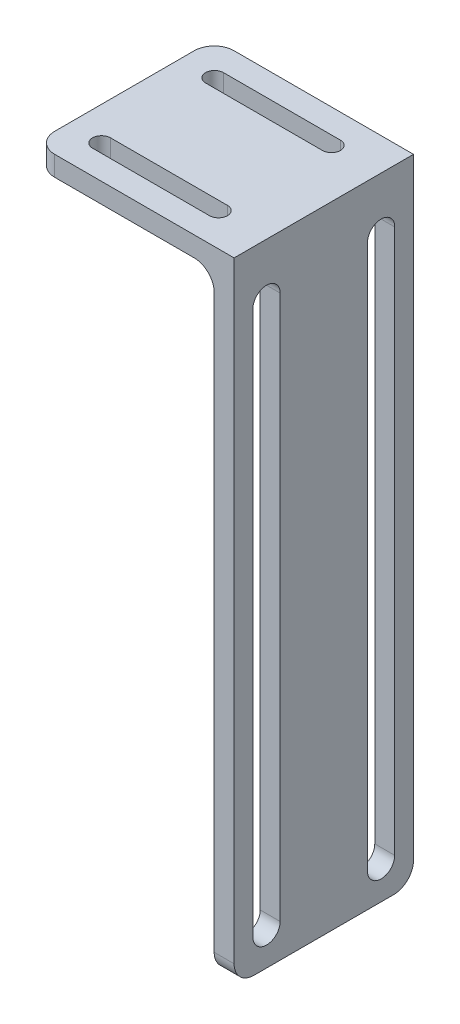
ISO-10303-21;
HEADER;
FILE_DESCRIPTION(('STEP AP214'),'2;1');
FILE_NAME('part.step','',(''),(''),'','','');
FILE_SCHEMA(('AUTOMOTIVE_DESIGN { 1 0 10303 214 1 1 1 1 }'));
ENDSEC;
DATA;
#1=APPLICATION_CONTEXT('core data for automotive mechanical design processes');
#2=APPLICATION_PROTOCOL_DEFINITION('international standard','automotive_design',2000,#1);
#3=PRODUCT_CONTEXT('',#1,'mechanical');
#4=PRODUCT('Part','Part','',(#3));
#5=PRODUCT_RELATED_PRODUCT_CATEGORY('part','',(#4));
#6=PRODUCT_DEFINITION_FORMATION('','',#4);
#7=PRODUCT_DEFINITION_CONTEXT('part definition',#1,'design');
#8=PRODUCT_DEFINITION('design','',#6,#7);
#9=PRODUCT_DEFINITION_SHAPE('','',#8);
#10=(LENGTH_UNIT() NAMED_UNIT(*) SI_UNIT(.MILLI.,.METRE.));
#11=(NAMED_UNIT(*) PLANE_ANGLE_UNIT() SI_UNIT($,.RADIAN.));
#12=(NAMED_UNIT(*) SI_UNIT($,.STERADIAN.) SOLID_ANGLE_UNIT());
#13=UNCERTAINTY_MEASURE_WITH_UNIT(LENGTH_MEASURE(1.E-05),#10,'distance_accuracy_value','');
#14=(GEOMETRIC_REPRESENTATION_CONTEXT(3) GLOBAL_UNCERTAINTY_ASSIGNED_CONTEXT((#13)) GLOBAL_UNIT_ASSIGNED_CONTEXT((#10,
#11,#12)) REPRESENTATION_CONTEXT('',''));
#15=CARTESIAN_POINT('',(0.,0.,0.));
#16=DIRECTION('',(0.,0.,1.));
#17=DIRECTION('',(1.,0.,0.));
#18=AXIS2_PLACEMENT_3D('',#15,#16,#17);
#19=CARTESIAN_POINT('',(0.,92.0000000000005,27.));
#20=DIRECTION('',(1.,0.,0.));
#21=DIRECTION('',(0.,0.,-1.));
#22=AXIS2_PLACEMENT_3D('',#19,#20,#21);
#23=PLANE('',#22);
#24=DIRECTION('',(0.,-1.,0.));
#25=VECTOR('',#24,1.);
#26=CARTESIAN_POINT('',(0.,92.0000000000005,0.));
#27=LINE('',#26,#25);
#28=CARTESIAN_POINT('',(0.,89.0000000000005,0.));
#29=VERTEX_POINT('',#28);
#30=CARTESIAN_POINT('',(0.,3.,0.));
#31=VERTEX_POINT('',#30);
#32=EDGE_CURVE('E394',#29,#31,#27,.T.);
#33=ORIENTED_EDGE('',*,*,#32,.T.);
#34=CARTESIAN_POINT('',(0.,3.,3.));
#35=DIRECTION('',(1.,0.,0.));
#36=DIRECTION('',(0.,0.,-1.));
#37=AXIS2_PLACEMENT_3D('',#34,#35,#36);
#38=CIRCLE('',#37,3.);
#39=CARTESIAN_POINT('',(0.,0.,3.));
#40=VERTEX_POINT('',#39);
#41=EDGE_CURVE('E520',#31,#40,#38,.F.);
#42=ORIENTED_EDGE('',*,*,#41,.T.);
#43=DIRECTION('',(0.,0.,-1.));
#44=VECTOR('',#43,1.);
#45=CARTESIAN_POINT('',(0.,0.,27.));
#46=LINE('',#45,#44);
#47=CARTESIAN_POINT('',(0.,0.,24.));
#48=VERTEX_POINT('',#47);
#49=EDGE_CURVE('E436',#48,#40,#46,.T.);
#50=ORIENTED_EDGE('',*,*,#49,.F.);
#51=CARTESIAN_POINT('',(0.,3.,24.));
#52=DIRECTION('',(1.,0.,0.));
#53=DIRECTION('',(0.,0.,-1.));
#54=AXIS2_PLACEMENT_3D('',#51,#52,#53);
#55=CIRCLE('',#54,3.);
#56=CARTESIAN_POINT('',(0.,3.,27.));
#57=VERTEX_POINT('',#56);
#58=EDGE_CURVE('E517',#48,#57,#55,.F.);
#59=ORIENTED_EDGE('',*,*,#58,.T.);
#60=DIRECTION('',(0.,-1.,0.));
#61=VECTOR('',#60,1.);
#62=CARTESIAN_POINT('',(0.,92.0000000000005,27.));
#63=LINE('',#62,#61);
#64=CARTESIAN_POINT('',(0.,89.0000000000005,27.));
#65=VERTEX_POINT('',#64);
#66=EDGE_CURVE('E395',#65,#57,#63,.T.);
#67=ORIENTED_EDGE('',*,*,#66,.F.);
#68=DIRECTION('',(0.,0.,-1.));
#69=VECTOR('',#68,1.);
#70=CARTESIAN_POINT('',(0.,89.0000000000005,0.));
#71=LINE('',#70,#69);
#72=CARTESIAN_POINT('',(0.,89.0000000000005,22.12));
#73=VERTEX_POINT('',#72);
#74=EDGE_CURVE('E477',#65,#73,#71,.T.);
#75=ORIENTED_EDGE('',*,*,#74,.T.);
#76=CARTESIAN_POINT('',(0.,86.9500000000007,22.12));
#77=DIRECTION('',(1.,0.,0.));
#78=DIRECTION('',(0.,0.,-1.));
#79=AXIS2_PLACEMENT_3D('',#76,#77,#78);
#80=CIRCLE('',#79,2.05);
#81=CARTESIAN_POINT('',(0.,86.9500000000007,24.17));
#82=VERTEX_POINT('',#81);
#83=EDGE_CURVE('E389',#73,#82,#80,.T.);
#84=ORIENTED_EDGE('',*,*,#83,.T.);
#85=DIRECTION('',(0.,-1.,0.));
#86=VECTOR('',#85,1.);
#87=CARTESIAN_POINT('',(0.,92.0000000000005,24.17));
#88=LINE('',#87,#86);
#89=CARTESIAN_POINT('',(0.,5.05,24.17));
#90=VERTEX_POINT('',#89);
#91=EDGE_CURVE('E377',#82,#90,#88,.T.);
#92=ORIENTED_EDGE('',*,*,#91,.T.);
#93=CARTESIAN_POINT('',(0.,5.05,22.12));
#94=DIRECTION('',(1.,0.,0.));
#95=DIRECTION('',(0.,0.,-1.));
#96=AXIS2_PLACEMENT_3D('',#93,#94,#95);
#97=CIRCLE('',#96,2.05);
#98=CARTESIAN_POINT('',(0.,5.05,20.07));
#99=VERTEX_POINT('',#98);
#100=EDGE_CURVE('E381',#90,#99,#97,.T.);
#101=ORIENTED_EDGE('',*,*,#100,.T.);
#102=DIRECTION('',(0.,1.,0.));
#103=VECTOR('',#102,1.);
#104=CARTESIAN_POINT('',(0.,92.0000000000005,20.07));
#105=LINE('',#104,#103);
#106=CARTESIAN_POINT('',(0.,86.9500000000007,20.07));
#107=VERTEX_POINT('',#106);
#108=EDGE_CURVE('E385',#99,#107,#105,.T.);
#109=ORIENTED_EDGE('',*,*,#108,.T.);
#110=EDGE_CURVE('E390',#107,#73,#80,.T.);
#111=ORIENTED_EDGE('',*,*,#110,.T.);
#112=DIRECTION('',(0.,0.,-1.));
#113=VECTOR('',#112,1.);
#114=CARTESIAN_POINT('',(0.,89.0000000000005,0.));
#115=LINE('',#114,#113);
#116=CARTESIAN_POINT('',(0.,89.0000000000005,4.88));
#117=VERTEX_POINT('',#116);
#118=EDGE_CURVE('E474',#73,#117,#115,.T.);
#119=ORIENTED_EDGE('',*,*,#118,.T.);
#120=CARTESIAN_POINT('',(0.,86.9500000000007,4.88));
#121=DIRECTION('',(1.,0.,0.));
#122=DIRECTION('',(0.,0.,-1.));
#123=AXIS2_PLACEMENT_3D('',#120,#121,#122);
#124=CIRCLE('',#123,2.05);
#125=CARTESIAN_POINT('',(0.,86.9500000000007,6.93));
#126=VERTEX_POINT('',#125);
#127=EDGE_CURVE('E372',#117,#126,#124,.T.);
#128=ORIENTED_EDGE('',*,*,#127,.T.);
#129=DIRECTION('',(0.,-1.,0.));
#130=VECTOR('',#129,1.);
#131=CARTESIAN_POINT('',(0.,92.0000000000005,6.93));
#132=LINE('',#131,#130);
#133=CARTESIAN_POINT('',(0.,5.05,6.92999999999999));
#134=VERTEX_POINT('',#133);
#135=EDGE_CURVE('E325',#126,#134,#132,.T.);
#136=ORIENTED_EDGE('',*,*,#135,.T.);
#137=CARTESIAN_POINT('',(0.,5.05,4.87999999999999));
#138=DIRECTION('',(1.,0.,0.));
#139=DIRECTION('',(0.,0.,-1.));
#140=AXIS2_PLACEMENT_3D('',#137,#138,#139);
#141=CIRCLE('',#140,2.05);
#142=CARTESIAN_POINT('',(0.,5.05,2.82999999999999));
#143=VERTEX_POINT('',#142);
#144=EDGE_CURVE('E364',#134,#143,#141,.T.);
#145=ORIENTED_EDGE('',*,*,#144,.T.);
#146=DIRECTION('',(0.,1.,0.));
#147=VECTOR('',#146,1.);
#148=CARTESIAN_POINT('',(0.,92.0000000000005,2.83));
#149=LINE('',#148,#147);
#150=CARTESIAN_POINT('',(0.,86.9500000000007,2.83));
#151=VERTEX_POINT('',#150);
#152=EDGE_CURVE('E368',#143,#151,#149,.T.);
#153=ORIENTED_EDGE('',*,*,#152,.T.);
#154=EDGE_CURVE('E373',#151,#117,#124,.T.);
#155=ORIENTED_EDGE('',*,*,#154,.T.);
#156=DIRECTION('',(0.,0.,-1.));
#157=VECTOR('',#156,1.);
#158=CARTESIAN_POINT('',(0.,89.0000000000005,0.));
#159=LINE('',#158,#157);
#160=EDGE_CURVE('E471',#117,#29,#159,.T.);
#161=ORIENTED_EDGE('',*,*,#160,.T.);
#162=EDGE_LOOP('',(#33,#42,#50,#59,#67,#75,#84,#92,#101,#109,#111,#119,#128,#136,#145,#153,#155,#161));
#163=FACE_BOUND('',#162,.T.);
#164=ADVANCED_FACE('F41',(#163),#23,.F.);
#165=CARTESIAN_POINT('',(0.,0.,27.));
#166=DIRECTION('',(0.,1.,0.));
#167=DIRECTION('',(0.,0.,1.));
#168=AXIS2_PLACEMENT_3D('',#165,#166,#167);
#169=PLANE('',#168);
#170=ORIENTED_EDGE('',*,*,#49,.T.);
#171=DIRECTION('',(1.,0.,0.));
#172=VECTOR('',#171,1.);
#173=CARTESIAN_POINT('',(0.,0.,3.));
#174=LINE('',#173,#172);
#175=CARTESIAN_POINT('',(3.,0.,3.));
#176=VERTEX_POINT('',#175);
#177=EDGE_CURVE('E501',#40,#176,#174,.T.);
#178=ORIENTED_EDGE('',*,*,#177,.T.);
#179=DIRECTION('',(0.,0.,-1.));
#180=VECTOR('',#179,1.);
#181=CARTESIAN_POINT('',(3.,0.,27.));
#182=LINE('',#181,#180);
#183=CARTESIAN_POINT('',(3.,0.,24.));
#184=VERTEX_POINT('',#183);
#185=EDGE_CURVE('E432',#184,#176,#182,.T.);
#186=ORIENTED_EDGE('',*,*,#185,.F.);
#187=DIRECTION('',(1.,0.,0.));
#188=VECTOR('',#187,1.);
#189=CARTESIAN_POINT('',(0.,0.,24.));
#190=LINE('',#189,#188);
#191=EDGE_CURVE('E498',#184,#48,#190,.F.);
#192=ORIENTED_EDGE('',*,*,#191,.T.);
#193=EDGE_LOOP('',(#170,#178,#186,#192));
#194=FACE_BOUND('',#193,.T.);
#195=ADVANCED_FACE('F581',(#194),#169,.F.);
#196=CARTESIAN_POINT('',(3.,0.,27.));
#197=DIRECTION('',(-1.,0.,0.));
#198=DIRECTION('',(0.,0.,1.));
#199=AXIS2_PLACEMENT_3D('',#196,#197,#198);
#200=PLANE('',#199);
#201=DIRECTION('',(0.,-1.,0.));
#202=VECTOR('',#201,1.);
#203=CARTESIAN_POINT('',(3.,86.9500000000007,24.17));
#204=LINE('',#203,#202);
#205=CARTESIAN_POINT('',(3.,86.9500000000007,24.17));
#206=VERTEX_POINT('',#205);
#207=CARTESIAN_POINT('',(3.,5.05,24.17));
#208=VERTEX_POINT('',#207);
#209=EDGE_CURVE('E308',#206,#208,#204,.T.);
#210=ORIENTED_EDGE('',*,*,#209,.F.);
#211=CARTESIAN_POINT('',(3.,86.9500000000007,22.12));
#212=DIRECTION('',(1.,0.,0.));
#213=DIRECTION('',(0.,0.,-1.));
#214=AXIS2_PLACEMENT_3D('',#211,#212,#213);
#215=CIRCLE('',#214,2.05);
#216=CARTESIAN_POINT('',(3.,86.9500000000007,20.07));
#217=VERTEX_POINT('',#216);
#218=EDGE_CURVE('E305',#217,#206,#215,.T.);
#219=ORIENTED_EDGE('',*,*,#218,.F.);
#220=DIRECTION('',(0.,1.,0.));
#221=VECTOR('',#220,1.);
#222=CARTESIAN_POINT('',(3.,86.9500000000007,20.07));
#223=LINE('',#222,#221);
#224=CARTESIAN_POINT('',(3.,5.05,20.07));
#225=VERTEX_POINT('',#224);
#226=EDGE_CURVE('E317',#225,#217,#223,.T.);
#227=ORIENTED_EDGE('',*,*,#226,.F.);
#228=CARTESIAN_POINT('',(3.,5.05,22.12));
#229=DIRECTION('',(1.,0.,0.));
#230=DIRECTION('',(0.,0.,-1.));
#231=AXIS2_PLACEMENT_3D('',#228,#229,#230);
#232=CIRCLE('',#231,2.05);
#233=EDGE_CURVE('E313',#208,#225,#232,.T.);
#234=ORIENTED_EDGE('',*,*,#233,.F.);
#235=EDGE_LOOP('',(#210,#219,#227,#234));
#236=FACE_BOUND('',#235,.T.);
#237=DIRECTION('',(0.,-1.,0.));
#238=VECTOR('',#237,1.);
#239=CARTESIAN_POINT('',(3.,86.9500000000007,6.93));
#240=LINE('',#239,#238);
#241=CARTESIAN_POINT('',(3.,86.9500000000007,6.93));
#242=VERTEX_POINT('',#241);
#243=CARTESIAN_POINT('',(3.,5.05,6.92999999999999));
#244=VERTEX_POINT('',#243);
#245=EDGE_CURVE('E337',#242,#244,#240,.T.);
#246=ORIENTED_EDGE('',*,*,#245,.F.);
#247=CARTESIAN_POINT('',(3.,86.9500000000007,4.88));
#248=DIRECTION('',(1.,0.,0.));
#249=DIRECTION('',(0.,0.,-1.));
#250=AXIS2_PLACEMENT_3D('',#247,#248,#249);
#251=CIRCLE('',#250,2.05);
#252=CARTESIAN_POINT('',(3.,86.9500000000007,2.83));
#253=VERTEX_POINT('',#252);
#254=EDGE_CURVE('E272',#253,#242,#251,.T.);
#255=ORIENTED_EDGE('',*,*,#254,.F.);
#256=DIRECTION('',(0.,1.,0.));
#257=VECTOR('',#256,1.);
#258=CARTESIAN_POINT('',(3.,86.9500000000007,2.83));
#259=LINE('',#258,#257);
#260=CARTESIAN_POINT('',(3.,5.05,2.82999999999999));
#261=VERTEX_POINT('',#260);
#262=EDGE_CURVE('E345',#261,#253,#259,.T.);
#263=ORIENTED_EDGE('',*,*,#262,.F.);
#264=CARTESIAN_POINT('',(3.,5.05,4.87999999999999));
#265=DIRECTION('',(1.,0.,0.));
#266=DIRECTION('',(0.,0.,-1.));
#267=AXIS2_PLACEMENT_3D('',#264,#265,#266);
#268=CIRCLE('',#267,2.05);
#269=EDGE_CURVE('E341',#244,#261,#268,.T.);
#270=ORIENTED_EDGE('',*,*,#269,.F.);
#271=EDGE_LOOP('',(#246,#255,#263,#270));
#272=FACE_BOUND('',#271,.T.);
#273=ORIENTED_EDGE('',*,*,#185,.T.);
#274=CARTESIAN_POINT('',(3.,3.,3.));
#275=DIRECTION('',(-1.,0.,0.));
#276=DIRECTION('',(0.,0.,1.));
#277=AXIS2_PLACEMENT_3D('',#274,#275,#276);
#278=CIRCLE('',#277,3.);
#279=CARTESIAN_POINT('',(3.,3.,0.));
#280=VERTEX_POINT('',#279);
#281=EDGE_CURVE('E508',#176,#280,#278,.F.);
#282=ORIENTED_EDGE('',*,*,#281,.T.);
#283=DIRECTION('',(0.,1.,0.));
#284=VECTOR('',#283,1.);
#285=CARTESIAN_POINT('',(3.,0.,0.));
#286=LINE('',#285,#284);
#287=CARTESIAN_POINT('',(3.,95.0000000000006,0.));
#288=VERTEX_POINT('',#287);
#289=EDGE_CURVE('E414',#280,#288,#286,.T.);
#290=ORIENTED_EDGE('',*,*,#289,.T.);
#291=DIRECTION('',(0.,0.,-1.));
#292=VECTOR('',#291,1.);
#293=CARTESIAN_POINT('',(3.,95.0000000000006,27.));
#294=LINE('',#293,#292);
#295=CARTESIAN_POINT('',(3.,95.0000000000006,27.));
#296=VERTEX_POINT('',#295);
#297=EDGE_CURVE('E428',#296,#288,#294,.T.);
#298=ORIENTED_EDGE('',*,*,#297,.F.);
#299=DIRECTION('',(0.,1.,0.));
#300=VECTOR('',#299,1.);
#301=CARTESIAN_POINT('',(3.,0.,27.));
#302=LINE('',#301,#300);
#303=CARTESIAN_POINT('',(3.,3.,27.));
#304=VERTEX_POINT('',#303);
#305=EDGE_CURVE('E399',#304,#296,#302,.T.);
#306=ORIENTED_EDGE('',*,*,#305,.F.);
#307=CARTESIAN_POINT('',(3.,3.,24.));
#308=DIRECTION('',(-1.,0.,0.));
#309=DIRECTION('',(0.,0.,1.));
#310=AXIS2_PLACEMENT_3D('',#307,#308,#309);
#311=CIRCLE('',#310,3.);
#312=EDGE_CURVE('E505',#304,#184,#311,.F.);
#313=ORIENTED_EDGE('',*,*,#312,.T.);
#314=EDGE_LOOP('',(#273,#282,#290,#298,#306,#313));
#315=FACE_BOUND('',#314,.T.);
#316=ADVANCED_FACE('F561',(#236,#272,#315),#200,.F.);
#317=CARTESIAN_POINT('',(3.,95.0000000000006,27.));
#318=DIRECTION('',(0.,-1.,0.));
#319=DIRECTION('',(0.,0.,-1.));
#320=AXIS2_PLACEMENT_3D('',#317,#318,#319);
#321=PLANE('',#320);
#322=DIRECTION('',(1.,0.,0.));
#323=VECTOR('',#322,1.);
#324=CARTESIAN_POINT('',(-21.95,95.0000000000006,6.35));
#325=LINE('',#324,#323);
#326=CARTESIAN_POINT('',(-21.95,95.0000000000006,6.35));
#327=VERTEX_POINT('',#326);
#328=CARTESIAN_POINT('',(-4.35,95.0000000000006,6.35));
#329=VERTEX_POINT('',#328);
#330=EDGE_CURVE('E251',#327,#329,#325,.T.);
#331=ORIENTED_EDGE('',*,*,#330,.F.);
#332=CARTESIAN_POINT('',(-21.95,95.0000000000006,5.));
#333=DIRECTION('',(0.,1.,0.));
#334=DIRECTION('',(0.,0.,1.));
#335=AXIS2_PLACEMENT_3D('',#332,#333,#334);
#336=CIRCLE('',#335,1.35);
#337=CARTESIAN_POINT('',(-21.95,95.0000000000006,3.65));
#338=VERTEX_POINT('',#337);
#339=EDGE_CURVE('E257',#338,#327,#336,.T.);
#340=ORIENTED_EDGE('',*,*,#339,.F.);
#341=DIRECTION('',(1.,0.,0.));
#342=VECTOR('',#341,1.);
#343=CARTESIAN_POINT('',(-21.95,95.0000000000006,3.65));
#344=LINE('',#343,#342);
#345=CARTESIAN_POINT('',(-4.35,95.0000000000006,3.65));
#346=VERTEX_POINT('',#345);
#347=EDGE_CURVE('E262',#338,#346,#344,.T.);
#348=ORIENTED_EDGE('',*,*,#347,.T.);
#349=CARTESIAN_POINT('',(-4.35,95.0000000000006,5.));
#350=DIRECTION('',(0.,1.,0.));
#351=DIRECTION('',(0.,0.,1.));
#352=AXIS2_PLACEMENT_3D('',#349,#350,#351);
#353=CIRCLE('',#352,1.35);
#354=EDGE_CURVE('E238',#329,#346,#353,.T.);
#355=ORIENTED_EDGE('',*,*,#354,.F.);
#356=EDGE_LOOP('',(#331,#340,#348,#355));
#357=FACE_BOUND('',#356,.T.);
#358=DIRECTION('',(1.,0.,0.));
#359=VECTOR('',#358,1.);
#360=CARTESIAN_POINT('',(-21.95,95.0000000000006,23.35));
#361=LINE('',#360,#359);
#362=CARTESIAN_POINT('',(-21.95,95.0000000000006,23.35));
#363=VERTEX_POINT('',#362);
#364=CARTESIAN_POINT('',(-4.35000000000001,95.0000000000006,23.35));
#365=VERTEX_POINT('',#364);
#366=EDGE_CURVE('E298',#363,#365,#361,.T.);
#367=ORIENTED_EDGE('',*,*,#366,.F.);
#368=CARTESIAN_POINT('',(-21.95,95.0000000000006,22.));
#369=DIRECTION('',(0.,1.,0.));
#370=DIRECTION('',(0.,0.,1.));
#371=AXIS2_PLACEMENT_3D('',#368,#369,#370);
#372=CIRCLE('',#371,1.35);
#373=CARTESIAN_POINT('',(-21.95,95.0000000000006,20.65));
#374=VERTEX_POINT('',#373);
#375=EDGE_CURVE('E302',#374,#363,#372,.T.);
#376=ORIENTED_EDGE('',*,*,#375,.F.);
#377=DIRECTION('',(1.,0.,0.));
#378=VECTOR('',#377,1.);
#379=CARTESIAN_POINT('',(-21.95,95.0000000000006,20.65));
#380=LINE('',#379,#378);
#381=CARTESIAN_POINT('',(-4.35000000000001,95.0000000000006,20.65));
#382=VERTEX_POINT('',#381);
#383=EDGE_CURVE('E281',#374,#382,#380,.T.);
#384=ORIENTED_EDGE('',*,*,#383,.T.);
#385=CARTESIAN_POINT('',(-4.35000000000001,95.0000000000006,22.));
#386=DIRECTION('',(0.,1.,0.));
#387=DIRECTION('',(0.,0.,1.));
#388=AXIS2_PLACEMENT_3D('',#385,#386,#387);
#389=CIRCLE('',#388,1.35);
#390=EDGE_CURVE('E294',#365,#382,#389,.T.);
#391=ORIENTED_EDGE('',*,*,#390,.F.);
#392=EDGE_LOOP('',(#367,#376,#384,#391));
#393=FACE_BOUND('',#392,.T.);
#394=DIRECTION('',(0.,0.,-1.));
#395=VECTOR('',#394,1.);
#396=CARTESIAN_POINT('',(-27.,95.0000000000006,27.));
#397=LINE('',#396,#395);
#398=CARTESIAN_POINT('',(-27.,95.0000000000006,24.));
#399=VERTEX_POINT('',#398);
#400=CARTESIAN_POINT('',(-27.,95.0000000000006,3.));
#401=VERTEX_POINT('',#400);
#402=EDGE_CURVE('E425',#399,#401,#397,.T.);
#403=ORIENTED_EDGE('',*,*,#402,.F.);
#404=CARTESIAN_POINT('',(-24.,95.0000000000006,24.));
#405=DIRECTION('',(0.,-1.,0.));
#406=DIRECTION('',(0.,0.,-1.));
#407=AXIS2_PLACEMENT_3D('',#404,#405,#406);
#408=CIRCLE('',#407,3.);
#409=CARTESIAN_POINT('',(-24.,95.0000000000006,27.));
#410=VERTEX_POINT('',#409);
#411=EDGE_CURVE('E11',#399,#410,#408,.F.);
#412=ORIENTED_EDGE('',*,*,#411,.T.);
#413=DIRECTION('',(-1.,0.,0.));
#414=VECTOR('',#413,1.);
#415=CARTESIAN_POINT('',(3.,95.0000000000006,27.));
#416=LINE('',#415,#414);
#417=EDGE_CURVE('E403',#296,#410,#416,.T.);
#418=ORIENTED_EDGE('',*,*,#417,.F.);
#419=ORIENTED_EDGE('',*,*,#297,.T.);
#420=DIRECTION('',(-1.,0.,0.));
#421=VECTOR('',#420,1.);
#422=CARTESIAN_POINT('',(3.,95.0000000000006,0.));
#423=LINE('',#422,#421);
#424=CARTESIAN_POINT('',(-24.,95.0000000000006,0.));
#425=VERTEX_POINT('',#424);
#426=EDGE_CURVE('E417',#288,#425,#423,.T.);
#427=ORIENTED_EDGE('',*,*,#426,.T.);
#428=CARTESIAN_POINT('',(-24.,95.0000000000006,3.));
#429=DIRECTION('',(0.,-1.,0.));
#430=DIRECTION('',(0.,0.,-1.));
#431=AXIS2_PLACEMENT_3D('',#428,#429,#430);
#432=CIRCLE('',#431,3.);
#433=EDGE_CURVE('E50',#425,#401,#432,.F.);
#434=ORIENTED_EDGE('',*,*,#433,.T.);
#435=EDGE_LOOP('',(#403,#412,#418,#419,#427,#434));
#436=FACE_BOUND('',#435,.T.);
#437=ADVANCED_FACE('F259',(#357,#393,#436),#321,.F.);
#438=CARTESIAN_POINT('',(-27.,95.0000000000006,27.));
#439=DIRECTION('',(1.,0.,0.));
#440=DIRECTION('',(0.,1.,0.));
#441=AXIS2_PLACEMENT_3D('',#438,#439,#440);
#442=PLANE('',#441);
#443=DIRECTION('',(0.,0.,-1.));
#444=VECTOR('',#443,1.);
#445=CARTESIAN_POINT('',(-27.,92.0000000000005,27.));
#446=LINE('',#445,#444);
#447=CARTESIAN_POINT('',(-27.,92.0000000000005,24.));
#448=VERTEX_POINT('',#447);
#449=CARTESIAN_POINT('',(-27.,92.0000000000005,3.));
#450=VERTEX_POINT('',#449);
#451=EDGE_CURVE('E410',#448,#450,#446,.T.);
#452=ORIENTED_EDGE('',*,*,#451,.F.);
#453=DIRECTION('',(0.,-1.,0.));
#454=VECTOR('',#453,1.);
#455=CARTESIAN_POINT('',(-27.,95.0000000000006,24.));
#456=LINE('',#455,#454);
#457=EDGE_CURVE('E63',#448,#399,#456,.F.);
#458=ORIENTED_EDGE('',*,*,#457,.T.);
#459=ORIENTED_EDGE('',*,*,#402,.T.);
#460=DIRECTION('',(0.,-1.,0.));
#461=VECTOR('',#460,1.);
#462=CARTESIAN_POINT('',(-27.,95.0000000000006,3.));
#463=LINE('',#462,#461);
#464=EDGE_CURVE('E537',#401,#450,#463,.T.);
#465=ORIENTED_EDGE('',*,*,#464,.T.);
#466=EDGE_LOOP('',(#452,#458,#459,#465));
#467=FACE_BOUND('',#466,.T.);
#468=ADVANCED_FACE('F624',(#467),#442,.F.);
#469=CARTESIAN_POINT('',(-27.,92.0000000000005,27.));
#470=DIRECTION('',(0.,1.,0.));
#471=DIRECTION('',(0.,0.,1.));
#472=AXIS2_PLACEMENT_3D('',#469,#470,#471);
#473=PLANE('',#472);
#474=DIRECTION('',(1.,0.,0.));
#475=VECTOR('',#474,1.);
#476=CARTESIAN_POINT('',(-27.,92.0000000000005,27.));
#477=LINE('',#476,#475);
#478=CARTESIAN_POINT('',(-24.,92.0000000000005,27.));
#479=VERTEX_POINT('',#478);
#480=CARTESIAN_POINT('',(-3.,92.0000000000005,27.));
#481=VERTEX_POINT('',#480);
#482=EDGE_CURVE('E407',#479,#481,#477,.T.);
#483=ORIENTED_EDGE('',*,*,#482,.F.);
#484=CARTESIAN_POINT('',(-24.,92.0000000000005,24.));
#485=DIRECTION('',(0.,1.,0.));
#486=DIRECTION('',(0.,0.,1.));
#487=AXIS2_PLACEMENT_3D('',#484,#485,#486);
#488=CIRCLE('',#487,3.);
#489=EDGE_CURVE('E534',#479,#448,#488,.F.);
#490=ORIENTED_EDGE('',*,*,#489,.T.);
#491=ORIENTED_EDGE('',*,*,#451,.T.);
#492=CARTESIAN_POINT('',(-24.,92.0000000000005,3.));
#493=DIRECTION('',(0.,1.,0.));
#494=DIRECTION('',(0.,0.,1.));
#495=AXIS2_PLACEMENT_3D('',#492,#493,#494);
#496=CIRCLE('',#495,3.);
#497=CARTESIAN_POINT('',(-24.,92.0000000000005,0.));
#498=VERTEX_POINT('',#497);
#499=EDGE_CURVE('E531',#450,#498,#496,.F.);
#500=ORIENTED_EDGE('',*,*,#499,.T.);
#501=DIRECTION('',(1.,0.,0.));
#502=VECTOR('',#501,1.);
#503=CARTESIAN_POINT('',(-27.,92.0000000000005,0.));
#504=LINE('',#503,#502);
#505=CARTESIAN_POINT('',(-3.,92.0000000000005,0.));
#506=VERTEX_POINT('',#505);
#507=EDGE_CURVE('E400',#498,#506,#504,.T.);
#508=ORIENTED_EDGE('',*,*,#507,.T.);
#509=DIRECTION('',(0.,0.,-1.));
#510=VECTOR('',#509,1.);
#511=CARTESIAN_POINT('',(-3.,92.0000000000005,27.));
#512=LINE('',#511,#510);
#513=CARTESIAN_POINT('',(-3.,92.0000000000005,5.));
#514=VERTEX_POINT('',#513);
#515=EDGE_CURVE('E488',#506,#514,#512,.F.);
#516=ORIENTED_EDGE('',*,*,#515,.T.);
#517=CARTESIAN_POINT('',(-4.35,92.0000000000005,5.));
#518=DIRECTION('',(0.,1.,0.));
#519=DIRECTION('',(0.,0.,1.));
#520=AXIS2_PLACEMENT_3D('',#517,#518,#519);
#521=CIRCLE('',#520,1.35);
#522=CARTESIAN_POINT('',(-4.35,92.0000000000005,3.65));
#523=VERTEX_POINT('',#522);
#524=EDGE_CURVE('E460',#514,#523,#521,.T.);
#525=ORIENTED_EDGE('',*,*,#524,.T.);
#526=DIRECTION('',(1.,0.,0.));
#527=VECTOR('',#526,1.);
#528=CARTESIAN_POINT('',(-27.,92.0000000000005,3.65));
#529=LINE('',#528,#527);
#530=CARTESIAN_POINT('',(-21.95,92.0000000000005,3.65));
#531=VERTEX_POINT('',#530);
#532=EDGE_CURVE('E463',#531,#523,#529,.T.);
#533=ORIENTED_EDGE('',*,*,#532,.F.);
#534=CARTESIAN_POINT('',(-21.95,92.0000000000005,5.));
#535=DIRECTION('',(0.,1.,0.));
#536=DIRECTION('',(0.,0.,1.));
#537=AXIS2_PLACEMENT_3D('',#534,#535,#536);
#538=CIRCLE('',#537,1.35);
#539=CARTESIAN_POINT('',(-21.95,92.0000000000005,6.35));
#540=VERTEX_POINT('',#539);
#541=EDGE_CURVE('E467',#531,#540,#538,.T.);
#542=ORIENTED_EDGE('',*,*,#541,.T.);
#543=DIRECTION('',(1.,0.,0.));
#544=VECTOR('',#543,1.);
#545=CARTESIAN_POINT('',(-27.,92.0000000000005,6.35));
#546=LINE('',#545,#544);
#547=CARTESIAN_POINT('',(-4.35,92.0000000000005,6.35));
#548=VERTEX_POINT('',#547);
#549=EDGE_CURVE('E457',#540,#548,#546,.T.);
#550=ORIENTED_EDGE('',*,*,#549,.T.);
#551=EDGE_CURVE('E242',#548,#514,#521,.T.);
#552=ORIENTED_EDGE('',*,*,#551,.T.);
#553=DIRECTION('',(0.,0.,-1.));
#554=VECTOR('',#553,1.);
#555=CARTESIAN_POINT('',(-3.,92.0000000000005,27.));
#556=LINE('',#555,#554);
#557=CARTESIAN_POINT('',(-3.,92.0000000000005,22.));
#558=VERTEX_POINT('',#557);
#559=EDGE_CURVE('E485',#514,#558,#556,.F.);
#560=ORIENTED_EDGE('',*,*,#559,.T.);
#561=CARTESIAN_POINT('',(-4.35000000000001,92.0000000000005,22.));
#562=DIRECTION('',(0.,1.,0.));
#563=DIRECTION('',(0.,0.,1.));
#564=AXIS2_PLACEMENT_3D('',#561,#562,#563);
#565=CIRCLE('',#564,1.35);
#566=CARTESIAN_POINT('',(-4.35000000000001,92.0000000000005,20.65));
#567=VERTEX_POINT('',#566);
#568=EDGE_CURVE('E444',#558,#567,#565,.T.);
#569=ORIENTED_EDGE('',*,*,#568,.T.);
#570=DIRECTION('',(1.,0.,0.));
#571=VECTOR('',#570,1.);
#572=CARTESIAN_POINT('',(-27.,92.0000000000005,20.65));
#573=LINE('',#572,#571);
#574=CARTESIAN_POINT('',(-21.95,92.0000000000005,20.65));
#575=VERTEX_POINT('',#574);
#576=EDGE_CURVE('E449',#575,#567,#573,.T.);
#577=ORIENTED_EDGE('',*,*,#576,.F.);
#578=CARTESIAN_POINT('',(-21.95,92.0000000000005,22.));
#579=DIRECTION('',(0.,1.,0.));
#580=DIRECTION('',(0.,0.,1.));
#581=AXIS2_PLACEMENT_3D('',#578,#579,#580);
#582=CIRCLE('',#581,1.35);
#583=CARTESIAN_POINT('',(-21.95,92.0000000000005,23.35));
#584=VERTEX_POINT('',#583);
#585=EDGE_CURVE('E453',#575,#584,#582,.T.);
#586=ORIENTED_EDGE('',*,*,#585,.T.);
#587=DIRECTION('',(1.,0.,0.));
#588=VECTOR('',#587,1.);
#589=CARTESIAN_POINT('',(-27.,92.0000000000005,23.35));
#590=LINE('',#589,#588);
#591=CARTESIAN_POINT('',(-4.35000000000001,92.0000000000005,23.35));
#592=VERTEX_POINT('',#591);
#593=EDGE_CURVE('E440',#584,#592,#590,.T.);
#594=ORIENTED_EDGE('',*,*,#593,.T.);
#595=EDGE_CURVE('E445',#592,#558,#565,.T.);
#596=ORIENTED_EDGE('',*,*,#595,.T.);
#597=DIRECTION('',(0.,0.,-1.));
#598=VECTOR('',#597,1.);
#599=CARTESIAN_POINT('',(-3.,92.0000000000005,27.));
#600=LINE('',#599,#598);
#601=EDGE_CURVE('E481',#558,#481,#600,.F.);
#602=ORIENTED_EDGE('',*,*,#601,.T.);
#603=EDGE_LOOP('',(#483,#490,#491,#500,#508,#516,#525,#533,#542,#550,#552,#560,#569,#577,#586,
#594,#596,#602));
#604=FACE_BOUND('',#603,.T.);
#605=ADVANCED_FACE('F626',(#604),#473,.F.);
#606=CARTESIAN_POINT('',(0.,0.,27.));
#607=DIRECTION('',(0.,0.,1.));
#608=DIRECTION('',(1.,0.,0.));
#609=AXIS2_PLACEMENT_3D('',#606,#607,#608);
#610=PLANE('',#609);
#611=ORIENTED_EDGE('',*,*,#66,.T.);
#612=DIRECTION('',(1.,0.,0.));
#613=VECTOR('',#612,1.);
#614=CARTESIAN_POINT('',(3.,3.,27.));
#615=LINE('',#614,#613);
#616=EDGE_CURVE('E527',#57,#304,#615,.T.);
#617=ORIENTED_EDGE('',*,*,#616,.T.);
#618=ORIENTED_EDGE('',*,*,#305,.T.);
#619=ORIENTED_EDGE('',*,*,#417,.T.);
#620=DIRECTION('',(0.,-1.,0.));
#621=VECTOR('',#620,1.);
#622=CARTESIAN_POINT('',(-24.,92.0000000000005,27.));
#623=LINE('',#622,#621);
#624=EDGE_CURVE('E523',#410,#479,#623,.T.);
#625=ORIENTED_EDGE('',*,*,#624,.T.);
#626=ORIENTED_EDGE('',*,*,#482,.T.);
#627=CARTESIAN_POINT('',(-3.,89.0000000000005,27.));
#628=DIRECTION('',(0.,0.,1.));
#629=DIRECTION('',(1.,0.,0.));
#630=AXIS2_PLACEMENT_3D('',#627,#628,#629);
#631=CIRCLE('',#630,3.);
#632=EDGE_CURVE('E495',#481,#65,#631,.F.);
#633=ORIENTED_EDGE('',*,*,#632,.T.);
#634=EDGE_LOOP('',(#611,#617,#618,#619,#625,#626,#633));
#635=FACE_BOUND('',#634,.T.);
#636=ADVANCED_FACE('F612',(#635),#610,.T.);
#637=CARTESIAN_POINT('',(0.,0.,0.));
#638=DIRECTION('',(0.,0.,1.));
#639=DIRECTION('',(1.,0.,0.));
#640=AXIS2_PLACEMENT_3D('',#637,#638,#639);
#641=PLANE('',#640);
#642=ORIENTED_EDGE('',*,*,#289,.F.);
#643=DIRECTION('',(1.,0.,0.));
#644=VECTOR('',#643,1.);
#645=CARTESIAN_POINT('',(0.,3.,0.));
#646=LINE('',#645,#644);
#647=EDGE_CURVE('E514',#280,#31,#646,.F.);
#648=ORIENTED_EDGE('',*,*,#647,.T.);
#649=ORIENTED_EDGE('',*,*,#32,.F.);
#650=CARTESIAN_POINT('',(-3.,89.0000000000005,0.));
#651=DIRECTION('',(0.,0.,1.));
#652=DIRECTION('',(1.,0.,0.));
#653=AXIS2_PLACEMENT_3D('',#650,#651,#652);
#654=CIRCLE('',#653,3.);
#655=EDGE_CURVE('E491',#29,#506,#654,.T.);
#656=ORIENTED_EDGE('',*,*,#655,.T.);
#657=ORIENTED_EDGE('',*,*,#507,.F.);
#658=DIRECTION('',(0.,-1.,0.));
#659=VECTOR('',#658,1.);
#660=CARTESIAN_POINT('',(-24.0000000000002,0.,0.));
#661=LINE('',#660,#659);
#662=EDGE_CURVE('E511',#498,#425,#661,.F.);
#663=ORIENTED_EDGE('',*,*,#662,.T.);
#664=ORIENTED_EDGE('',*,*,#426,.F.);
#665=EDGE_LOOP('',(#642,#648,#649,#656,#657,#663,#664));
#666=FACE_BOUND('',#665,.T.);
#667=ADVANCED_FACE('F577',(#666),#641,.F.);
#668=CARTESIAN_POINT('',(-27.,86.9500000000007,4.88));
#669=DIRECTION('',(1.,0.,0.));
#670=DIRECTION('',(0.,0.,-1.));
#671=AXIS2_PLACEMENT_3D('',#668,#669,#670);
#672=CYLINDRICAL_SURFACE('',#671,2.05);
#673=DIRECTION('',(1.,0.,0.));
#674=VECTOR('',#673,1.);
#675=CARTESIAN_POINT('',(-27.,86.9500000000007,2.83));
#676=LINE('',#675,#674);
#677=EDGE_CURVE('E309',#151,#253,#676,.T.);
#678=ORIENTED_EDGE('',*,*,#677,.T.);
#679=ORIENTED_EDGE('',*,*,#254,.T.);
#680=DIRECTION('',(1.,0.,0.));
#681=VECTOR('',#680,1.);
#682=CARTESIAN_POINT('',(-27.,86.9500000000007,6.93));
#683=LINE('',#682,#681);
#684=EDGE_CURVE('E349',#126,#242,#683,.T.);
#685=ORIENTED_EDGE('',*,*,#684,.F.);
#686=ORIENTED_EDGE('',*,*,#127,.F.);
#687=ORIENTED_EDGE('',*,*,#154,.F.);
#688=EDGE_LOOP('',(#678,#679,#685,#686,#687));
#689=FACE_BOUND('',#688,.T.);
#690=ADVANCED_FACE('F556',(#689),#672,.F.);
#691=CARTESIAN_POINT('',(-27.,86.9500000000007,2.83));
#692=DIRECTION('',(0.,0.,-1.));
#693=DIRECTION('',(0.,1.,0.));
#694=AXIS2_PLACEMENT_3D('',#691,#692,#693);
#695=PLANE('',#694);
#696=DIRECTION('',(1.,0.,0.));
#697=VECTOR('',#696,1.);
#698=CARTESIAN_POINT('',(-27.,5.05,2.82999999999999));
#699=LINE('',#698,#697);
#700=EDGE_CURVE('E352',#143,#261,#699,.T.);
#701=ORIENTED_EDGE('',*,*,#700,.T.);
#702=ORIENTED_EDGE('',*,*,#262,.T.);
#703=ORIENTED_EDGE('',*,*,#677,.F.);
#704=ORIENTED_EDGE('',*,*,#152,.F.);
#705=EDGE_LOOP('',(#701,#702,#703,#704));
#706=FACE_BOUND('',#705,.T.);
#707=ADVANCED_FACE('F569',(#706),#695,.F.);
#708=CARTESIAN_POINT('',(-27.,5.05,4.87999999999999));
#709=DIRECTION('',(1.,0.,0.));
#710=DIRECTION('',(0.,0.,-1.));
#711=AXIS2_PLACEMENT_3D('',#708,#709,#710);
#712=CYLINDRICAL_SURFACE('',#711,2.05);
#713=DIRECTION('',(1.,0.,0.));
#714=VECTOR('',#713,1.);
#715=CARTESIAN_POINT('',(-27.,5.05,6.92999999999999));
#716=LINE('',#715,#714);
#717=EDGE_CURVE('E355',#134,#244,#716,.T.);
#718=ORIENTED_EDGE('',*,*,#717,.T.);
#719=ORIENTED_EDGE('',*,*,#269,.T.);
#720=ORIENTED_EDGE('',*,*,#700,.F.);
#721=ORIENTED_EDGE('',*,*,#144,.F.);
#722=EDGE_LOOP('',(#718,#719,#720,#721));
#723=FACE_BOUND('',#722,.T.);
#724=ADVANCED_FACE('F566',(#723),#712,.F.);
#725=CARTESIAN_POINT('',(-27.,86.9500000000007,6.93));
#726=DIRECTION('',(0.,0.,1.));
#727=DIRECTION('',(0.,-1.,0.));
#728=AXIS2_PLACEMENT_3D('',#725,#726,#727);
#729=PLANE('',#728);
#730=ORIENTED_EDGE('',*,*,#684,.T.);
#731=ORIENTED_EDGE('',*,*,#245,.T.);
#732=ORIENTED_EDGE('',*,*,#717,.F.);
#733=ORIENTED_EDGE('',*,*,#135,.F.);
#734=EDGE_LOOP('',(#730,#731,#732,#733));
#735=FACE_BOUND('',#734,.T.);
#736=ADVANCED_FACE('F553',(#735),#729,.F.);
#737=CARTESIAN_POINT('',(-27.,86.9500000000007,22.12));
#738=DIRECTION('',(1.,0.,0.));
#739=DIRECTION('',(0.,0.,-1.));
#740=AXIS2_PLACEMENT_3D('',#737,#738,#739);
#741=CYLINDRICAL_SURFACE('',#740,2.05);
#742=DIRECTION('',(1.,0.,0.));
#743=VECTOR('',#742,1.);
#744=CARTESIAN_POINT('',(-27.,86.9500000000007,20.07));
#745=LINE('',#744,#743);
#746=EDGE_CURVE('E322',#107,#217,#745,.T.);
#747=ORIENTED_EDGE('',*,*,#746,.T.);
#748=ORIENTED_EDGE('',*,*,#218,.T.);
#749=DIRECTION('',(1.,0.,0.));
#750=VECTOR('',#749,1.);
#751=CARTESIAN_POINT('',(-27.,86.9500000000007,24.17));
#752=LINE('',#751,#750);
#753=EDGE_CURVE('E321',#82,#206,#752,.T.);
#754=ORIENTED_EDGE('',*,*,#753,.F.);
#755=ORIENTED_EDGE('',*,*,#83,.F.);
#756=ORIENTED_EDGE('',*,*,#110,.F.);
#757=EDGE_LOOP('',(#747,#748,#754,#755,#756));
#758=FACE_BOUND('',#757,.T.);
#759=ADVANCED_FACE('F682',(#758),#741,.F.);
#760=CARTESIAN_POINT('',(-27.,86.9500000000007,20.07));
#761=DIRECTION('',(0.,0.,-1.));
#762=DIRECTION('',(0.,1.,0.));
#763=AXIS2_PLACEMENT_3D('',#760,#761,#762);
#764=PLANE('',#763);
#765=DIRECTION('',(1.,0.,0.));
#766=VECTOR('',#765,1.);
#767=CARTESIAN_POINT('',(-27.,5.05,20.07));
#768=LINE('',#767,#766);
#769=EDGE_CURVE('E326',#99,#225,#768,.T.);
#770=ORIENTED_EDGE('',*,*,#769,.T.);
#771=ORIENTED_EDGE('',*,*,#226,.T.);
#772=ORIENTED_EDGE('',*,*,#746,.F.);
#773=ORIENTED_EDGE('',*,*,#108,.F.);
#774=EDGE_LOOP('',(#770,#771,#772,#773));
#775=FACE_BOUND('',#774,.T.);
#776=ADVANCED_FACE('F678',(#775),#764,.F.);
#777=CARTESIAN_POINT('',(-27.,5.05,22.12));
#778=DIRECTION('',(1.,0.,0.));
#779=DIRECTION('',(0.,0.,-1.));
#780=AXIS2_PLACEMENT_3D('',#777,#778,#779);
#781=CYLINDRICAL_SURFACE('',#780,2.05);
#782=DIRECTION('',(1.,0.,0.));
#783=VECTOR('',#782,1.);
#784=CARTESIAN_POINT('',(-27.,5.05,24.17));
#785=LINE('',#784,#783);
#786=EDGE_CURVE('E329',#90,#208,#785,.T.);
#787=ORIENTED_EDGE('',*,*,#786,.T.);
#788=ORIENTED_EDGE('',*,*,#233,.T.);
#789=ORIENTED_EDGE('',*,*,#769,.F.);
#790=ORIENTED_EDGE('',*,*,#100,.F.);
#791=EDGE_LOOP('',(#787,#788,#789,#790));
#792=FACE_BOUND('',#791,.T.);
#793=ADVANCED_FACE('F681',(#792),#781,.F.);
#794=CARTESIAN_POINT('',(-27.,86.9500000000007,24.17));
#795=DIRECTION('',(0.,0.,1.));
#796=DIRECTION('',(0.,-1.,0.));
#797=AXIS2_PLACEMENT_3D('',#794,#795,#796);
#798=PLANE('',#797);
#799=ORIENTED_EDGE('',*,*,#753,.T.);
#800=ORIENTED_EDGE('',*,*,#209,.T.);
#801=ORIENTED_EDGE('',*,*,#786,.F.);
#802=ORIENTED_EDGE('',*,*,#91,.F.);
#803=EDGE_LOOP('',(#799,#800,#801,#802));
#804=FACE_BOUND('',#803,.T.);
#805=ADVANCED_FACE('F666',(#804),#798,.F.);
#806=CARTESIAN_POINT('',(-21.95,0.,22.));
#807=DIRECTION('',(0.,1.,0.));
#808=DIRECTION('',(0.,0.,1.));
#809=AXIS2_PLACEMENT_3D('',#806,#807,#808);
#810=CYLINDRICAL_SURFACE('',#809,1.35);
#811=DIRECTION('',(0.,1.,0.));
#812=VECTOR('',#811,1.);
#813=CARTESIAN_POINT('',(-21.95,0.,20.65));
#814=LINE('',#813,#812);
#815=EDGE_CURVE('E288',#575,#374,#814,.T.);
#816=ORIENTED_EDGE('',*,*,#815,.T.);
#817=ORIENTED_EDGE('',*,*,#375,.T.);
#818=DIRECTION('',(0.,1.,0.));
#819=VECTOR('',#818,1.);
#820=CARTESIAN_POINT('',(-21.95,0.,23.35));
#821=LINE('',#820,#819);
#822=EDGE_CURVE('E277',#584,#363,#821,.T.);
#823=ORIENTED_EDGE('',*,*,#822,.F.);
#824=ORIENTED_EDGE('',*,*,#585,.F.);
#825=EDGE_LOOP('',(#816,#817,#823,#824));
#826=FACE_BOUND('',#825,.T.);
#827=ADVANCED_FACE('F662',(#826),#810,.F.);
#828=CARTESIAN_POINT('',(-21.95,0.,20.65));
#829=DIRECTION('',(0.,0.,1.));
#830=DIRECTION('',(1.,0.,0.));
#831=AXIS2_PLACEMENT_3D('',#828,#829,#830);
#832=PLANE('',#831);
#833=ORIENTED_EDGE('',*,*,#576,.T.);
#834=DIRECTION('',(0.,1.,0.));
#835=VECTOR('',#834,1.);
#836=CARTESIAN_POINT('',(-4.35000000000001,0.,20.65));
#837=LINE('',#836,#835);
#838=EDGE_CURVE('E285',#567,#382,#837,.T.);
#839=ORIENTED_EDGE('',*,*,#838,.T.);
#840=ORIENTED_EDGE('',*,*,#383,.F.);
#841=ORIENTED_EDGE('',*,*,#815,.F.);
#842=EDGE_LOOP('',(#833,#839,#840,#841));
#843=FACE_BOUND('',#842,.T.);
#844=ADVANCED_FACE('F665',(#843),#832,.T.);
#845=CARTESIAN_POINT('',(-4.35000000000001,0.,22.));
#846=DIRECTION('',(0.,1.,0.));
#847=DIRECTION('',(0.,0.,1.));
#848=AXIS2_PLACEMENT_3D('',#845,#846,#847);
#849=CYLINDRICAL_SURFACE('',#848,1.35);
#850=DIRECTION('',(0.,1.,0.));
#851=VECTOR('',#850,1.);
#852=CARTESIAN_POINT('',(-4.35000000000001,0.,23.35));
#853=LINE('',#852,#851);
#854=EDGE_CURVE('E282',#592,#365,#853,.T.);
#855=ORIENTED_EDGE('',*,*,#854,.T.);
#856=ORIENTED_EDGE('',*,*,#390,.T.);
#857=ORIENTED_EDGE('',*,*,#838,.F.);
#858=ORIENTED_EDGE('',*,*,#568,.F.);
#859=ORIENTED_EDGE('',*,*,#595,.F.);
#860=EDGE_LOOP('',(#855,#856,#857,#858,#859));
#861=FACE_BOUND('',#860,.T.);
#862=ADVANCED_FACE('F670',(#861),#849,.F.);
#863=CARTESIAN_POINT('',(-21.95,0.,23.35));
#864=DIRECTION('',(0.,0.,1.));
#865=DIRECTION('',(1.,0.,0.));
#866=AXIS2_PLACEMENT_3D('',#863,#864,#865);
#867=PLANE('',#866);
#868=ORIENTED_EDGE('',*,*,#822,.T.);
#869=ORIENTED_EDGE('',*,*,#366,.T.);
#870=ORIENTED_EDGE('',*,*,#854,.F.);
#871=ORIENTED_EDGE('',*,*,#593,.F.);
#872=EDGE_LOOP('',(#868,#869,#870,#871));
#873=FACE_BOUND('',#872,.T.);
#874=ADVANCED_FACE('F657',(#873),#867,.F.);
#875=CARTESIAN_POINT('',(-21.95,0.,5.));
#876=DIRECTION('',(0.,1.,0.));
#877=DIRECTION('',(0.,0.,1.));
#878=AXIS2_PLACEMENT_3D('',#875,#876,#877);
#879=CYLINDRICAL_SURFACE('',#878,1.35);
#880=DIRECTION('',(0.,1.,0.));
#881=VECTOR('',#880,1.);
#882=CARTESIAN_POINT('',(-21.95,0.,3.65));
#883=LINE('',#882,#881);
#884=EDGE_CURVE('E269',#531,#338,#883,.T.);
#885=ORIENTED_EDGE('',*,*,#884,.T.);
#886=ORIENTED_EDGE('',*,*,#339,.T.);
#887=DIRECTION('',(0.,1.,0.));
#888=VECTOR('',#887,1.);
#889=CARTESIAN_POINT('',(-21.95,0.,6.35));
#890=LINE('',#889,#888);
#891=EDGE_CURVE('E247',#540,#327,#890,.T.);
#892=ORIENTED_EDGE('',*,*,#891,.F.);
#893=ORIENTED_EDGE('',*,*,#541,.F.);
#894=EDGE_LOOP('',(#885,#886,#892,#893));
#895=FACE_BOUND('',#894,.T.);
#896=ADVANCED_FACE('F645',(#895),#879,.F.);
#897=CARTESIAN_POINT('',(-21.95,0.,3.65));
#898=DIRECTION('',(0.,0.,1.));
#899=DIRECTION('',(1.,0.,0.));
#900=AXIS2_PLACEMENT_3D('',#897,#898,#899);
#901=PLANE('',#900);
#902=ORIENTED_EDGE('',*,*,#532,.T.);
#903=DIRECTION('',(0.,1.,0.));
#904=VECTOR('',#903,1.);
#905=CARTESIAN_POINT('',(-4.35,0.,3.65));
#906=LINE('',#905,#904);
#907=EDGE_CURVE('E246',#523,#346,#906,.T.);
#908=ORIENTED_EDGE('',*,*,#907,.T.);
#909=ORIENTED_EDGE('',*,*,#347,.F.);
#910=ORIENTED_EDGE('',*,*,#884,.F.);
#911=EDGE_LOOP('',(#902,#908,#909,#910));
#912=FACE_BOUND('',#911,.T.);
#913=ADVANCED_FACE('F649',(#912),#901,.T.);
#914=CARTESIAN_POINT('',(-4.35,0.,5.));
#915=DIRECTION('',(0.,1.,0.));
#916=DIRECTION('',(0.,0.,1.));
#917=AXIS2_PLACEMENT_3D('',#914,#915,#916);
#918=CYLINDRICAL_SURFACE('',#917,1.35);
#919=DIRECTION('',(0.,1.,0.));
#920=VECTOR('',#919,1.);
#921=CARTESIAN_POINT('',(-4.35,0.,6.35));
#922=LINE('',#921,#920);
#923=EDGE_CURVE('E233',#548,#329,#922,.T.);
#924=ORIENTED_EDGE('',*,*,#923,.T.);
#925=ORIENTED_EDGE('',*,*,#354,.T.);
#926=ORIENTED_EDGE('',*,*,#907,.F.);
#927=ORIENTED_EDGE('',*,*,#524,.F.);
#928=ORIENTED_EDGE('',*,*,#551,.F.);
#929=EDGE_LOOP('',(#924,#925,#926,#927,#928));
#930=FACE_BOUND('',#929,.T.);
#931=ADVANCED_FACE('F235',(#930),#918,.F.);
#932=CARTESIAN_POINT('',(-21.95,0.,6.35));
#933=DIRECTION('',(0.,0.,1.));
#934=DIRECTION('',(1.,0.,0.));
#935=AXIS2_PLACEMENT_3D('',#932,#933,#934);
#936=PLANE('',#935);
#937=ORIENTED_EDGE('',*,*,#891,.T.);
#938=ORIENTED_EDGE('',*,*,#330,.T.);
#939=ORIENTED_EDGE('',*,*,#923,.F.);
#940=ORIENTED_EDGE('',*,*,#549,.F.);
#941=EDGE_LOOP('',(#937,#938,#939,#940));
#942=FACE_BOUND('',#941,.T.);
#943=ADVANCED_FACE('F252',(#942),#936,.F.);
#944=CARTESIAN_POINT('',(-3.,89.0000000000005,27.));
#945=DIRECTION('',(0.,0.,1.));
#946=DIRECTION('',(1.,0.,0.));
#947=AXIS2_PLACEMENT_3D('',#944,#945,#946);
#948=CYLINDRICAL_SURFACE('',#947,3.);
#949=ORIENTED_EDGE('',*,*,#559,.F.);
#950=ORIENTED_EDGE('',*,*,#515,.F.);
#951=ORIENTED_EDGE('',*,*,#655,.F.);
#952=ORIENTED_EDGE('',*,*,#160,.F.);
#953=ORIENTED_EDGE('',*,*,#118,.F.);
#954=ORIENTED_EDGE('',*,*,#74,.F.);
#955=ORIENTED_EDGE('',*,*,#632,.F.);
#956=ORIENTED_EDGE('',*,*,#601,.F.);
#957=EDGE_LOOP('',(#949,#950,#951,#952,#953,#954,#955,#956));
#958=FACE_BOUND('',#957,.T.);
#959=ADVANCED_FACE('F590',(#958),#948,.F.);
#960=CARTESIAN_POINT('',(0.,3.,3.));
#961=DIRECTION('',(1.,0.,0.));
#962=DIRECTION('',(0.,0.,-1.));
#963=AXIS2_PLACEMENT_3D('',#960,#961,#962);
#964=CYLINDRICAL_SURFACE('',#963,3.);
#965=ORIENTED_EDGE('',*,*,#41,.F.);
#966=ORIENTED_EDGE('',*,*,#647,.F.);
#967=ORIENTED_EDGE('',*,*,#281,.F.);
#968=ORIENTED_EDGE('',*,*,#177,.F.);
#969=EDGE_LOOP('',(#965,#966,#967,#968));
#970=FACE_BOUND('',#969,.T.);
#971=ADVANCED_FACE('F593',(#970),#964,.T.);
#972=CARTESIAN_POINT('',(0.,3.,24.));
#973=DIRECTION('',(-1.,0.,0.));
#974=DIRECTION('',(0.,0.,1.));
#975=AXIS2_PLACEMENT_3D('',#972,#973,#974);
#976=CYLINDRICAL_SURFACE('',#975,3.);
#977=ORIENTED_EDGE('',*,*,#58,.F.);
#978=ORIENTED_EDGE('',*,*,#191,.F.);
#979=ORIENTED_EDGE('',*,*,#312,.F.);
#980=ORIENTED_EDGE('',*,*,#616,.F.);
#981=EDGE_LOOP('',(#977,#978,#979,#980));
#982=FACE_BOUND('',#981,.T.);
#983=ADVANCED_FACE('F597',(#982),#976,.T.);
#984=CARTESIAN_POINT('',(-24.0000000000002,0.,24.));
#985=DIRECTION('',(0.,1.,0.));
#986=DIRECTION('',(-1.,0.,0.));
#987=AXIS2_PLACEMENT_3D('',#984,#985,#986);
#988=CYLINDRICAL_SURFACE('',#987,3.);
#989=ORIENTED_EDGE('',*,*,#411,.F.);
#990=ORIENTED_EDGE('',*,*,#457,.F.);
#991=ORIENTED_EDGE('',*,*,#489,.F.);
#992=ORIENTED_EDGE('',*,*,#624,.F.);
#993=EDGE_LOOP('',(#989,#990,#991,#992));
#994=FACE_BOUND('',#993,.T.);
#995=ADVANCED_FACE('F600',(#994),#988,.T.);
#996=CARTESIAN_POINT('',(-24.,95.0000000000006,3.));
#997=DIRECTION('',(0.,-1.,0.));
#998=DIRECTION('',(1.,0.,0.));
#999=AXIS2_PLACEMENT_3D('',#996,#997,#998);
#1000=CYLINDRICAL_SURFACE('',#999,3.);
#1001=ORIENTED_EDGE('',*,*,#433,.F.);
#1002=ORIENTED_EDGE('',*,*,#662,.F.);
#1003=ORIENTED_EDGE('',*,*,#499,.F.);
#1004=ORIENTED_EDGE('',*,*,#464,.F.);
#1005=EDGE_LOOP('',(#1001,#1002,#1003,#1004));
#1006=FACE_BOUND('',#1005,.T.);
#1007=ADVANCED_FACE('F43',(#1006),#1000,.T.);
#1008=CLOSED_SHELL('',(#164,#195,#316,#437,#468,#605,#636,#667,#690,#707,#724,#736,#759,#776,
#793,#805,#827,#844,#862,#874,#896,#913,#931,#943,#959,#971,#983,#995,#1007));
#1009=MANIFOLD_SOLID_BREP('B2',#1008);
#1010=ADVANCED_BREP_SHAPE_REPRESENTATION('',(#18,#1009),#14);
#1011=SHAPE_DEFINITION_REPRESENTATION(#9,#1010);
ENDSEC;
END-ISO-10303-21;
